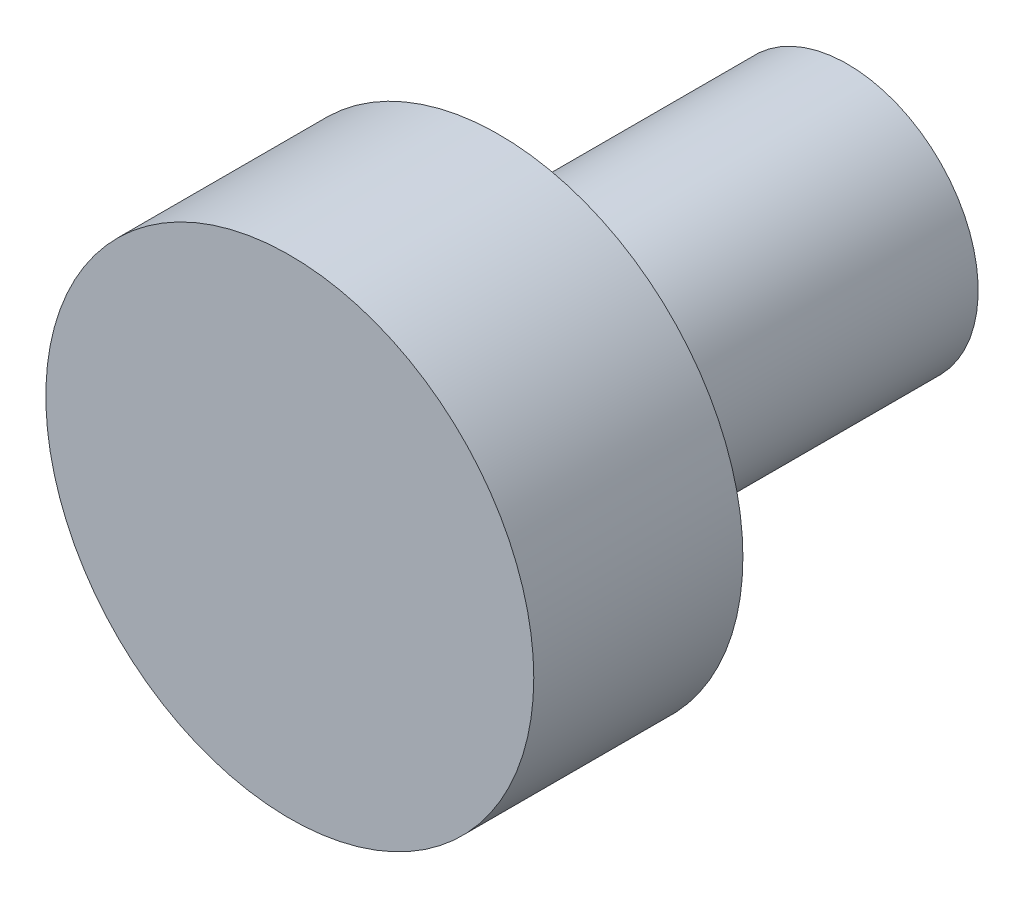
ISO-10303-21;
HEADER;
FILE_DESCRIPTION(('STEP AP214'),'2;1');
FILE_NAME('part.step','',(''),(''),'','','');
FILE_SCHEMA(('AUTOMOTIVE_DESIGN { 1 0 10303 214 1 1 1 1 }'));
ENDSEC;
DATA;
#1=APPLICATION_CONTEXT('core data for automotive mechanical design processes');
#2=APPLICATION_PROTOCOL_DEFINITION('international standard','automotive_design',2000,#1);
#3=PRODUCT_CONTEXT('',#1,'mechanical');
#4=PRODUCT('Part','Part','',(#3));
#5=PRODUCT_RELATED_PRODUCT_CATEGORY('part','',(#4));
#6=PRODUCT_DEFINITION_FORMATION('','',#4);
#7=PRODUCT_DEFINITION_CONTEXT('part definition',#1,'design');
#8=PRODUCT_DEFINITION('design','',#6,#7);
#9=PRODUCT_DEFINITION_SHAPE('','',#8);
#10=(LENGTH_UNIT() NAMED_UNIT(*) SI_UNIT(.MILLI.,.METRE.));
#11=(NAMED_UNIT(*) PLANE_ANGLE_UNIT() SI_UNIT($,.RADIAN.));
#12=(NAMED_UNIT(*) SI_UNIT($,.STERADIAN.) SOLID_ANGLE_UNIT());
#13=UNCERTAINTY_MEASURE_WITH_UNIT(LENGTH_MEASURE(1.E-05),#10,'distance_accuracy_value','');
#14=(GEOMETRIC_REPRESENTATION_CONTEXT(3) GLOBAL_UNCERTAINTY_ASSIGNED_CONTEXT((#13)) GLOBAL_UNIT_ASSIGNED_CONTEXT((#10,
#11,#12)) REPRESENTATION_CONTEXT('',''));
#15=CARTESIAN_POINT('',(0.,0.,0.));
#16=DIRECTION('',(0.,0.,1.));
#17=DIRECTION('',(1.,0.,0.));
#18=AXIS2_PLACEMENT_3D('',#15,#16,#17);
#19=CARTESIAN_POINT('',(0.,0.,2.4));
#20=DIRECTION('',(0.,0.,-1.));
#21=DIRECTION('',(-1.,0.,0.));
#22=AXIS2_PLACEMENT_3D('',#19,#20,#21);
#23=CYLINDRICAL_SURFACE('',#22,2.8);
#24=CARTESIAN_POINT('',(0.,0.,2.4));
#25=DIRECTION('',(0.,0.,1.));
#26=DIRECTION('',(1.,0.,0.));
#27=AXIS2_PLACEMENT_3D('',#24,#25,#26);
#28=CIRCLE('',#27,2.8);
#29=CARTESIAN_POINT('',(2.8,0.,2.4));
#30=VERTEX_POINT('',#29);
#31=EDGE_CURVE('E37',#30,#30,#28,.T.);
#32=ORIENTED_EDGE('',*,*,#31,.F.);
#33=EDGE_LOOP('',(#32));
#34=FACE_BOUND('',#33,.T.);
#35=CARTESIAN_POINT('',(0.,0.,0.));
#36=DIRECTION('',(0.,0.,1.));
#37=DIRECTION('',(1.,0.,0.));
#38=AXIS2_PLACEMENT_3D('',#35,#36,#37);
#39=CIRCLE('',#38,2.8);
#40=CARTESIAN_POINT('',(2.8,0.,0.));
#41=VERTEX_POINT('',#40);
#42=EDGE_CURVE('E33',#41,#41,#39,.T.);
#43=ORIENTED_EDGE('',*,*,#42,.T.);
#44=EDGE_LOOP('',(#43));
#45=FACE_BOUND('',#44,.T.);
#46=ADVANCED_FACE('F30',(#34,#45),#23,.T.);
#47=CARTESIAN_POINT('',(0.,0.,2.4));
#48=DIRECTION('',(0.,0.,1.));
#49=DIRECTION('',(1.,0.,0.));
#50=AXIS2_PLACEMENT_3D('',#47,#48,#49);
#51=PLANE('',#50);
#52=ORIENTED_EDGE('',*,*,#31,.T.);
#53=EDGE_LOOP('',(#52));
#54=FACE_BOUND('',#53,.T.);
#55=ADVANCED_FACE('F54',(#54),#51,.T.);
#56=CARTESIAN_POINT('',(0.,0.,0.));
#57=DIRECTION('',(0.,0.,1.));
#58=DIRECTION('',(1.,0.,0.));
#59=AXIS2_PLACEMENT_3D('',#56,#57,#58);
#60=PLANE('',#59);
#61=CARTESIAN_POINT('',(0.,0.,0.));
#62=DIRECTION('',(0.,0.,-1.));
#63=DIRECTION('',(-1.,0.,0.));
#64=AXIS2_PLACEMENT_3D('',#61,#62,#63);
#65=CIRCLE('',#64,1.5);
#66=CARTESIAN_POINT('',(-1.5,0.,0.));
#67=VERTEX_POINT('',#66);
#68=EDGE_CURVE('E10',#67,#67,#65,.T.);
#69=ORIENTED_EDGE('',*,*,#68,.F.);
#70=EDGE_LOOP('',(#69));
#71=FACE_BOUND('',#70,.T.);
#72=ORIENTED_EDGE('',*,*,#42,.F.);
#73=EDGE_LOOP('',(#72));
#74=FACE_BOUND('',#73,.T.);
#75=ADVANCED_FACE('F51',(#71,#74),#60,.F.);
#76=CARTESIAN_POINT('',(0.,0.,-4.));
#77=DIRECTION('',(0.,0.,1.));
#78=DIRECTION('',(1.,0.,0.));
#79=AXIS2_PLACEMENT_3D('',#76,#77,#78);
#80=CYLINDRICAL_SURFACE('',#79,1.5);
#81=CARTESIAN_POINT('',(0.,0.,-4.));
#82=DIRECTION('',(0.,0.,-1.));
#83=DIRECTION('',(-1.,0.,0.));
#84=AXIS2_PLACEMENT_3D('',#81,#82,#83);
#85=CIRCLE('',#84,1.5);
#86=CARTESIAN_POINT('',(-1.5,0.,-4.));
#87=VERTEX_POINT('',#86);
#88=EDGE_CURVE('E43',#87,#87,#85,.T.);
#89=ORIENTED_EDGE('',*,*,#88,.F.);
#90=EDGE_LOOP('',(#89));
#91=FACE_BOUND('',#90,.T.);
#92=ORIENTED_EDGE('',*,*,#68,.T.);
#93=EDGE_LOOP('',(#92));
#94=FACE_BOUND('',#93,.T.);
#95=ADVANCED_FACE('F53',(#91,#94),#80,.T.);
#96=CARTESIAN_POINT('',(0.,0.,-4.));
#97=DIRECTION('',(0.,0.,-1.));
#98=DIRECTION('',(-1.,0.,0.));
#99=AXIS2_PLACEMENT_3D('',#96,#97,#98);
#100=PLANE('',#99);
#101=ORIENTED_EDGE('',*,*,#88,.T.);
#102=EDGE_LOOP('',(#101));
#103=FACE_BOUND('',#102,.T.);
#104=ADVANCED_FACE('F60',(#103),#100,.T.);
#105=CLOSED_SHELL('',(#46,#55,#75,#95,#104));
#106=MANIFOLD_SOLID_BREP('B2',#105);
#107=ADVANCED_BREP_SHAPE_REPRESENTATION('',(#18,#106),#14);
#108=SHAPE_DEFINITION_REPRESENTATION(#9,#107);
ENDSEC;
END-ISO-10303-21;
